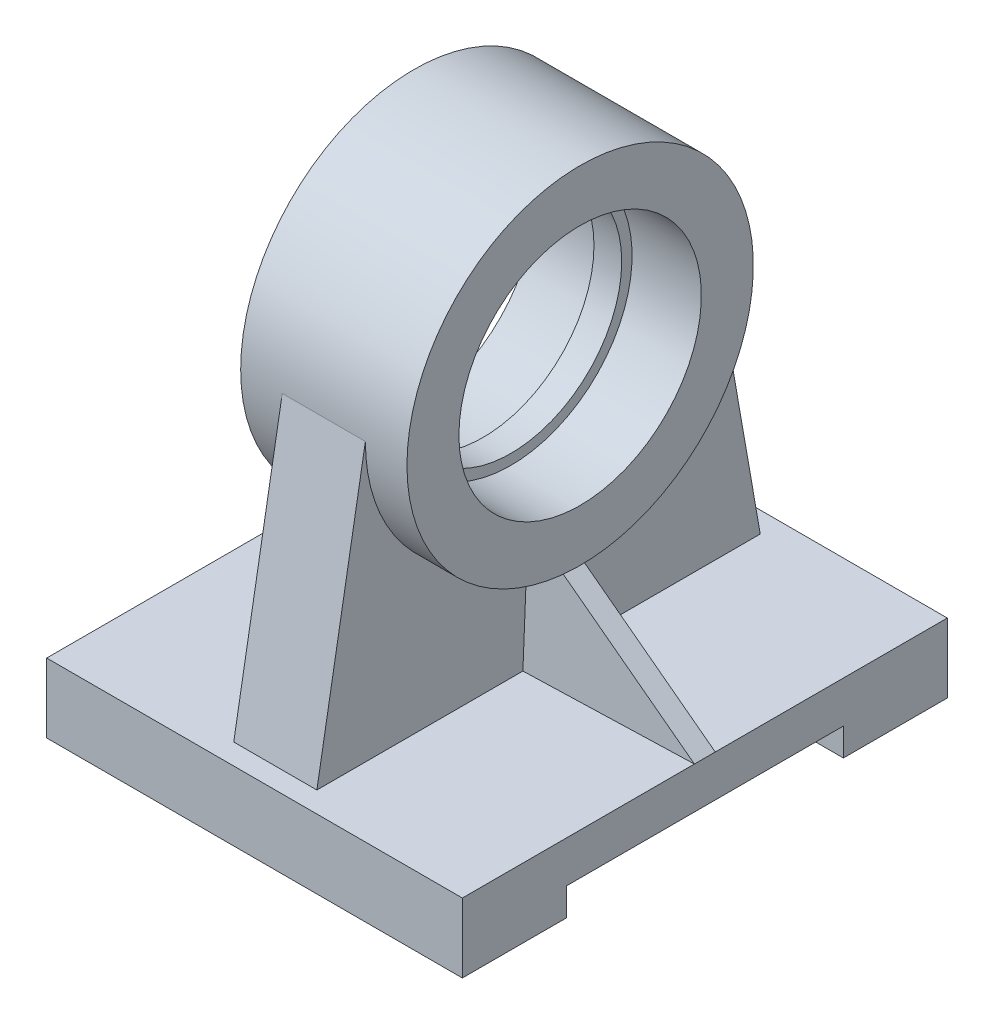
ISO-10303-21;
HEADER;
FILE_DESCRIPTION(('STEP AP214'),'2;1');
FILE_NAME('part.step','',(''),(''),'','','');
FILE_SCHEMA(('AUTOMOTIVE_DESIGN { 1 0 10303 214 1 1 1 1 }'));
ENDSEC;
DATA;
#1=APPLICATION_CONTEXT('core data for automotive mechanical design processes');
#2=APPLICATION_PROTOCOL_DEFINITION('international standard','automotive_design',2000,#1);
#3=PRODUCT_CONTEXT('',#1,'mechanical');
#4=PRODUCT('Part','Part','',(#3));
#5=PRODUCT_RELATED_PRODUCT_CATEGORY('part','',(#4));
#6=PRODUCT_DEFINITION_FORMATION('','',#4);
#7=PRODUCT_DEFINITION_CONTEXT('part definition',#1,'design');
#8=PRODUCT_DEFINITION('design','',#6,#7);
#9=PRODUCT_DEFINITION_SHAPE('','',#8);
#10=(LENGTH_UNIT() NAMED_UNIT(*) SI_UNIT(.MILLI.,.METRE.));
#11=(NAMED_UNIT(*) PLANE_ANGLE_UNIT() SI_UNIT($,.RADIAN.));
#12=(NAMED_UNIT(*) SI_UNIT($,.STERADIAN.) SOLID_ANGLE_UNIT());
#13=UNCERTAINTY_MEASURE_WITH_UNIT(LENGTH_MEASURE(1.E-05),#10,'distance_accuracy_value','');
#14=(GEOMETRIC_REPRESENTATION_CONTEXT(3) GLOBAL_UNCERTAINTY_ASSIGNED_CONTEXT((#13)) GLOBAL_UNIT_ASSIGNED_CONTEXT((#10,
#11,#12)) REPRESENTATION_CONTEXT('',''));
#15=CARTESIAN_POINT('',(0.,0.,0.));
#16=DIRECTION('',(0.,0.,1.));
#17=DIRECTION('',(1.,0.,0.));
#18=AXIS2_PLACEMENT_3D('',#15,#16,#17);
#19=CARTESIAN_POINT('',(-30.,-50.0694080199998,-35.0000000000006));
#20=DIRECTION('',(0.,-1.,0.));
#21=DIRECTION('',(0.,0.,-1.));
#22=AXIS2_PLACEMENT_3D('',#19,#20,#21);
#23=PLANE('',#22);
#24=DIRECTION('',(1.,0.,0.));
#25=VECTOR('',#24,1.);
#26=CARTESIAN_POINT('',(-30.,-50.0694080199999,-20.0000000000006));
#27=LINE('',#26,#25);
#28=CARTESIAN_POINT('',(-30.,-50.0694080199999,-20.0000000000006));
#29=VERTEX_POINT('',#28);
#30=CARTESIAN_POINT('',(30.,-50.0694080199999,-20.0000000000006));
#31=VERTEX_POINT('',#30);
#32=EDGE_CURVE('E204',#29,#31,#27,.T.);
#33=ORIENTED_EDGE('',*,*,#32,.F.);
#34=DIRECTION('',(0.,0.,-1.));
#35=VECTOR('',#34,1.);
#36=CARTESIAN_POINT('',(-30.,-50.0694080199998,-35.0000000000006));
#37=LINE('',#36,#35);
#38=CARTESIAN_POINT('',(-30.,-50.0694080199998,-35.0000000000006));
#39=VERTEX_POINT('',#38);
#40=EDGE_CURVE('E275',#29,#39,#37,.T.);
#41=ORIENTED_EDGE('',*,*,#40,.T.);
#42=DIRECTION('',(1.,0.,0.));
#43=VECTOR('',#42,1.);
#44=CARTESIAN_POINT('',(-30.,-50.0694080199998,-35.0000000000006));
#45=LINE('',#44,#43);
#46=CARTESIAN_POINT('',(30.,-50.0694080199998,-35.0000000000006));
#47=VERTEX_POINT('',#46);
#48=EDGE_CURVE('E280',#39,#47,#45,.T.);
#49=ORIENTED_EDGE('',*,*,#48,.T.);
#50=DIRECTION('',(0.,0.,-1.));
#51=VECTOR('',#50,1.);
#52=CARTESIAN_POINT('',(30.,-50.0694080199998,-35.0000000000006));
#53=LINE('',#52,#51);
#54=EDGE_CURVE('E262',#31,#47,#53,.T.);
#55=ORIENTED_EDGE('',*,*,#54,.F.);
#56=EDGE_LOOP('',(#33,#41,#49,#55));
#57=FACE_BOUND('',#56,.T.);
#58=ADVANCED_FACE('F35',(#57),#23,.T.);
#59=CARTESIAN_POINT('',(-6.,0.,0.));
#60=DIRECTION('',(1.,0.,0.));
#61=DIRECTION('',(0.,0.,-1.));
#62=AXIS2_PLACEMENT_3D('',#59,#60,#61);
#63=PLANE('',#62);
#64=DIRECTION('',(0.,-1.,0.));
#65=VECTOR('',#64,1.);
#66=CARTESIAN_POINT('',(-6.,0.,-2.));
#67=LINE('',#66,#65);
#68=CARTESIAN_POINT('',(-6.,-24.9198715887544,-2.));
#69=VERTEX_POINT('',#68);
#70=CARTESIAN_POINT('',(-6.,-40.0694080199996,-2.));
#71=VERTEX_POINT('',#70);
#72=EDGE_CURVE('E216',#69,#71,#67,.T.);
#73=ORIENTED_EDGE('',*,*,#72,.F.);
#74=CARTESIAN_POINT('',(-6.,0.,0.));
#75=DIRECTION('',(-1.,0.,0.));
#76=DIRECTION('',(0.,0.,-1.));
#77=AXIS2_PLACEMENT_3D('',#74,#75,#76);
#78=CIRCLE('',#77,25.0000000000002);
#79=CARTESIAN_POINT('',(-6.,1.73472347597681E-13,-25.0000000000003));
#80=VERTEX_POINT('',#79);
#81=EDGE_CURVE('E302',#80,#69,#78,.T.);
#82=ORIENTED_EDGE('',*,*,#81,.F.);
#83=DIRECTION('',(0.,0.985081128769097,0.172090585863962));
#84=VECTOR('',#83,1.);
#85=CARTESIAN_POINT('',(-6.,1.73472347597681E-13,-25.0000000000003));
#86=LINE('',#85,#84);
#87=CARTESIAN_POINT('',(-6.,-40.0694080199998,-32.0000000000005));
#88=VERTEX_POINT('',#87);
#89=EDGE_CURVE('E312',#88,#80,#86,.T.);
#90=ORIENTED_EDGE('',*,*,#89,.F.);
#91=DIRECTION('',(0.,0.,-1.));
#92=VECTOR('',#91,1.);
#93=CARTESIAN_POINT('',(-6.,-40.0694080199998,32.));
#94=LINE('',#93,#92);
#95=EDGE_CURVE('E308',#71,#88,#94,.T.);
#96=ORIENTED_EDGE('',*,*,#95,.F.);
#97=EDGE_LOOP('',(#73,#82,#90,#96));
#98=FACE_BOUND('',#97,.T.);
#99=ADVANCED_FACE('F363',(#98),#63,.F.);
#100=CARTESIAN_POINT('',(-30.,-40.06940802,35.));
#101=DIRECTION('',(0.,1.,0.));
#102=DIRECTION('',(0.,0.,1.));
#103=AXIS2_PLACEMENT_3D('',#100,#101,#102);
#104=PLANE('',#103);
#105=DIRECTION('',(1.,0.,0.));
#106=VECTOR('',#105,1.);
#107=CARTESIAN_POINT('',(-30.,-40.0694080199999,2.));
#108=LINE('',#107,#106);
#109=CARTESIAN_POINT('',(-30.,-40.06940802,2.));
#110=VERTEX_POINT('',#109);
#111=CARTESIAN_POINT('',(-6.,-40.0694080199996,2.));
#112=VERTEX_POINT('',#111);
#113=EDGE_CURVE('E220',#110,#112,#108,.T.);
#114=ORIENTED_EDGE('',*,*,#113,.F.);
#115=DIRECTION('',(0.,0.,1.));
#116=VECTOR('',#115,1.);
#117=CARTESIAN_POINT('',(-30.,-40.06940802,35.));
#118=LINE('',#117,#116);
#119=CARTESIAN_POINT('',(-30.,-40.06940802,35.));
#120=VERTEX_POINT('',#119);
#121=EDGE_CURVE('E267',#110,#120,#118,.T.);
#122=ORIENTED_EDGE('',*,*,#121,.T.);
#123=DIRECTION('',(1.,0.,0.));
#124=VECTOR('',#123,1.);
#125=CARTESIAN_POINT('',(-30.,-40.06940802,35.));
#126=LINE('',#125,#124);
#127=CARTESIAN_POINT('',(30.,-40.06940802,35.));
#128=VERTEX_POINT('',#127);
#129=EDGE_CURVE('E286',#120,#128,#126,.T.);
#130=ORIENTED_EDGE('',*,*,#129,.T.);
#131=DIRECTION('',(0.,0.,1.));
#132=VECTOR('',#131,1.);
#133=CARTESIAN_POINT('',(30.,-40.06940802,35.));
#134=LINE('',#133,#132);
#135=CARTESIAN_POINT('',(30.,-40.0694080199999,1.5055801745095));
#136=VERTEX_POINT('',#135);
#137=EDGE_CURVE('E256',#136,#128,#134,.T.);
#138=ORIENTED_EDGE('',*,*,#137,.F.);
#139=DIRECTION('',(0.999503061957107,0.,-0.0315218834838297));
#140=VECTOR('',#139,1.);
#141=CARTESIAN_POINT('',(-30.9956647800323,-40.0694080199999,3.42923434966542));
#142=LINE('',#141,#140);
#143=CARTESIAN_POINT('',(5.99999999999999,-40.0694080199998,2.26248151119033));
#144=VERTEX_POINT('',#143);
#145=EDGE_CURVE('E243',#144,#136,#142,.T.);
#146=ORIENTED_EDGE('',*,*,#145,.F.);
#147=DIRECTION('',(0.,0.,-1.));
#148=VECTOR('',#147,1.);
#149=CARTESIAN_POINT('',(6.,-40.0694080199998,32.));
#150=LINE('',#149,#148);
#151=CARTESIAN_POINT('',(6.,-40.06940802,32.));
#152=VERTEX_POINT('',#151);
#153=EDGE_CURVE('E296',#152,#144,#150,.T.);
#154=ORIENTED_EDGE('',*,*,#153,.F.);
#155=DIRECTION('',(1.,0.,0.));
#156=VECTOR('',#155,1.);
#157=CARTESIAN_POINT('',(-6.,-40.0694080199998,32.));
#158=LINE('',#157,#156);
#159=CARTESIAN_POINT('',(-6.,-40.06940802,32.));
#160=VERTEX_POINT('',#159);
#161=EDGE_CURVE('E323',#160,#152,#158,.T.);
#162=ORIENTED_EDGE('',*,*,#161,.F.);
#163=EDGE_CURVE('E309',#160,#112,#94,.T.);
#164=ORIENTED_EDGE('',*,*,#163,.T.);
#165=EDGE_LOOP('',(#114,#122,#130,#138,#146,#154,#162,#164));
#166=FACE_BOUND('',#165,.T.);
#167=ADVANCED_FACE('F370',(#166),#104,.T.);
#168=CARTESIAN_POINT('',(6.,0.,0.));
#169=DIRECTION('',(1.,0.,0.));
#170=DIRECTION('',(0.,0.,-1.));
#171=AXIS2_PLACEMENT_3D('',#168,#169,#170);
#172=PLANE('',#171);
#173=DIRECTION('',(0.,-0.999125170375753,-0.0418197790719003));
#174=VECTOR('',#173,1.);
#175=CARTESIAN_POINT('',(6.,0.0244565595260672,-0.584296826658878));
#176=LINE('',#175,#174);
#177=CARTESIAN_POINT('',(6.,-24.9468377304652,-1.62950521626846));
#178=VERTEX_POINT('',#177);
#179=CARTESIAN_POINT('',(6.,-40.0694080199998,-2.26248151119033));
#180=VERTEX_POINT('',#179);
#181=EDGE_CURVE('E239',#178,#180,#176,.T.);
#182=ORIENTED_EDGE('',*,*,#181,.T.);
#183=CARTESIAN_POINT('',(6.,-40.0694080199995,-32.0000000000005));
#184=VERTEX_POINT('',#183);
#185=EDGE_CURVE('E295',#180,#184,#150,.T.);
#186=ORIENTED_EDGE('',*,*,#185,.T.);
#187=DIRECTION('',(0.,0.985081128769097,0.172090585863962));
#188=VECTOR('',#187,1.);
#189=CARTESIAN_POINT('',(6.,1.73472347597681E-13,-25.0000000000003));
#190=LINE('',#189,#188);
#191=CARTESIAN_POINT('',(6.00000000000001,0.,-25.));
#192=VERTEX_POINT('',#191);
#193=EDGE_CURVE('E299',#184,#192,#190,.T.);
#194=ORIENTED_EDGE('',*,*,#193,.T.);
#195=CARTESIAN_POINT('',(6.,0.,0.));
#196=DIRECTION('',(-1.,0.,0.));
#197=DIRECTION('',(0.,0.,-1.));
#198=AXIS2_PLACEMENT_3D('',#195,#196,#197);
#199=CIRCLE('',#198,25.0000000000002);
#200=EDGE_CURVE('E290',#192,#178,#199,.T.);
#201=ORIENTED_EDGE('',*,*,#200,.T.);
#202=EDGE_LOOP('',(#182,#186,#194,#201));
#203=FACE_BOUND('',#202,.T.);
#204=ADVANCED_FACE('F454',(#203),#172,.T.);
#205=CARTESIAN_POINT('',(-66.4679952920497,0.,0.));
#206=DIRECTION('',(-1.,0.,0.));
#207=DIRECTION('',(0.,0.,1.));
#208=AXIS2_PLACEMENT_3D('',#205,#206,#207);
#209=CYLINDRICAL_SURFACE('',#208,25.);
#210=CARTESIAN_POINT('',(12.0000000000004,0.,0.));
#211=DIRECTION('',(-1.,0.,0.));
#212=DIRECTION('',(0.,0.,1.));
#213=AXIS2_PLACEMENT_3D('',#210,#211,#212);
#214=CIRCLE('',#213,25.0000000000001);
#215=CARTESIAN_POINT('',(12.0000000000004,0.,25.0000000000001));
#216=VERTEX_POINT('',#215);
#217=EDGE_CURVE('E43',#216,#216,#214,.T.);
#218=ORIENTED_EDGE('',*,*,#217,.T.);
#219=EDGE_LOOP('',(#218));
#220=FACE_BOUND('',#219,.T.);
#221=DIRECTION('',(1.,0.,0.));
#222=VECTOR('',#221,1.);
#223=CARTESIAN_POINT('',(-6.,0.,25.0000000000001));
#224=LINE('',#223,#222);
#225=CARTESIAN_POINT('',(-6.,0.,25.0000000000001));
#226=VERTEX_POINT('',#225);
#227=CARTESIAN_POINT('',(6.,0.,25.0000000000001));
#228=VERTEX_POINT('',#227);
#229=EDGE_CURVE('E315',#226,#228,#224,.T.);
#230=ORIENTED_EDGE('',*,*,#229,.T.);
#231=CARTESIAN_POINT('',(6.,-24.9468377304652,1.62950521626846));
#232=VERTEX_POINT('',#231);
#233=EDGE_CURVE('E283',#232,#228,#199,.T.);
#234=ORIENTED_EDGE('',*,*,#233,.F.);
#235=CARTESIAN_POINT('',(24.5594754319652,0.,0.));
#236=DIRECTION('',(0.0314943345710287,0.0417990335509261,0.998629534754574));
#237=DIRECTION('',(-0.999503930402441,0.00131708611377693,0.03146678239415));
#238=AXIS2_PLACEMENT_3D('',#235,#236,#237);
#239=ELLIPSE('',#238,793.793561302842,25.);
#240=CARTESIAN_POINT('',(9.9397765142211,-24.9546233860206,1.50558017450951));
#241=VERTEX_POINT('',#240);
#242=EDGE_CURVE('E247',#232,#241,#239,.T.);
#243=ORIENTED_EDGE('',*,*,#242,.T.);
#244=CARTESIAN_POINT('',(-23.1798037014066,0.,0.));
#245=DIRECTION('',(0.601772411013792,0.79866761881439,0.));
#246=DIRECTION('',(-0.79866761881439,0.601772411013792,0.));
#247=AXIS2_PLACEMENT_3D('',#244,#245,#246);
#248=ELLIPSE('',#247,41.5439450902761,25.);
#249=CARTESIAN_POINT('',(9.93977651422111,-24.9546233860206,-1.50558017450951));
#250=VERTEX_POINT('',#249);
#251=EDGE_CURVE('E250',#241,#250,#248,.T.);
#252=ORIENTED_EDGE('',*,*,#251,.T.);
#253=CARTESIAN_POINT('',(24.5594754319652,0.,0.));
#254=DIRECTION('',(-0.0314943345710287,-0.0417990335509261,0.998629534754574));
#255=DIRECTION('',(-0.999503930402441,0.00131708611377693,-0.03146678239415));
#256=AXIS2_PLACEMENT_3D('',#253,#254,#255);
#257=ELLIPSE('',#256,793.793561302842,25.);
#258=EDGE_CURVE('E241',#178,#250,#257,.T.);
#259=ORIENTED_EDGE('',*,*,#258,.F.);
#260=ORIENTED_EDGE('',*,*,#200,.F.);
#261=DIRECTION('',(1.,0.,0.));
#262=VECTOR('',#261,1.);
#263=CARTESIAN_POINT('',(-6.,1.73472347597681E-13,-25.0000000000003));
#264=LINE('',#263,#262);
#265=EDGE_CURVE('E316',#80,#192,#264,.T.);
#266=ORIENTED_EDGE('',*,*,#265,.F.);
#267=ORIENTED_EDGE('',*,*,#81,.T.);
#268=DIRECTION('',(-1.,0.,0.));
#269=VECTOR('',#268,1.);
#270=CARTESIAN_POINT('',(-66.4679952920497,-24.9198715887543,-2.));
#271=LINE('',#270,#269);
#272=CARTESIAN_POINT('',(-9.89365420175839,-24.9198715887543,-2.));
#273=VERTEX_POINT('',#272);
#274=EDGE_CURVE('E217',#273,#69,#271,.F.);
#275=ORIENTED_EDGE('',*,*,#274,.F.);
#276=CARTESIAN_POINT('',(23.1798037014066,0.,0.));
#277=DIRECTION('',(0.601772411013792,-0.79866761881439,0.));
#278=DIRECTION('',(-0.79866761881439,-0.601772411013792,0.));
#279=AXIS2_PLACEMENT_3D('',#276,#277,#278);
#280=ELLIPSE('',#279,41.5439450902761,25.);
#281=CARTESIAN_POINT('',(-9.89365420175839,-24.9198715887543,2.));
#282=VERTEX_POINT('',#281);
#283=EDGE_CURVE('E58',#273,#282,#280,.F.);
#284=ORIENTED_EDGE('',*,*,#283,.T.);
#285=DIRECTION('',(-1.,0.,0.));
#286=VECTOR('',#285,1.);
#287=CARTESIAN_POINT('',(-66.4679952920497,-24.9198715887543,2.));
#288=LINE('',#287,#286);
#289=CARTESIAN_POINT('',(-6.,-24.9198715887544,2.));
#290=VERTEX_POINT('',#289);
#291=EDGE_CURVE('E226',#282,#290,#288,.F.);
#292=ORIENTED_EDGE('',*,*,#291,.T.);
#293=EDGE_CURVE('E301',#290,#226,#78,.T.);
#294=ORIENTED_EDGE('',*,*,#293,.T.);
#295=EDGE_LOOP('',(#230,#234,#243,#252,#259,#260,#266,#267,#275,#284,#292,#294));
#296=FACE_BOUND('',#295,.T.);
#297=CARTESIAN_POINT('',(-12.,0.,0.));
#298=DIRECTION('',(-1.,0.,0.));
#299=DIRECTION('',(0.,0.,1.));
#300=AXIS2_PLACEMENT_3D('',#297,#298,#299);
#301=CIRCLE('',#300,25.);
#302=CARTESIAN_POINT('',(-12.,0.,25.));
#303=VERTEX_POINT('',#302);
#304=EDGE_CURVE('E342',#303,#303,#301,.T.);
#305=ORIENTED_EDGE('',*,*,#304,.F.);
#306=EDGE_LOOP('',(#305));
#307=FACE_BOUND('',#306,.T.);
#308=ADVANCED_FACE('F347',(#220,#296,#307),#209,.T.);
#309=CARTESIAN_POINT('',(-66.4679952920497,0.,0.));
#310=DIRECTION('',(-1.,0.,0.));
#311=DIRECTION('',(0.,0.,1.));
#312=AXIS2_PLACEMENT_3D('',#309,#310,#311);
#313=CYLINDRICAL_SURFACE('',#312,17.5000000000001);
#314=CARTESIAN_POINT('',(2.00000000000045,0.,0.));
#315=DIRECTION('',(-1.,0.,0.));
#316=DIRECTION('',(0.,0.,1.));
#317=AXIS2_PLACEMENT_3D('',#314,#315,#316);
#318=CIRCLE('',#317,17.5);
#319=CARTESIAN_POINT('',(2.00000000000045,0.,17.5));
#320=VERTEX_POINT('',#319);
#321=EDGE_CURVE('E319',#320,#320,#318,.T.);
#322=ORIENTED_EDGE('',*,*,#321,.T.);
#323=EDGE_LOOP('',(#322));
#324=FACE_BOUND('',#323,.T.);
#325=CARTESIAN_POINT('',(12.0000000000005,0.,0.));
#326=DIRECTION('',(-1.,0.,0.));
#327=DIRECTION('',(0.,0.,1.));
#328=AXIS2_PLACEMENT_3D('',#325,#326,#327);
#329=CIRCLE('',#328,17.5000000000001);
#330=CARTESIAN_POINT('',(12.0000000000005,0.,17.5000000000001));
#331=VERTEX_POINT('',#330);
#332=EDGE_CURVE('E11',#331,#331,#329,.T.);
#333=ORIENTED_EDGE('',*,*,#332,.F.);
#334=EDGE_LOOP('',(#333));
#335=FACE_BOUND('',#334,.T.);
#336=ADVANCED_FACE('F37',(#324,#335),#313,.F.);
#337=CARTESIAN_POINT('',(12.0000000000004,17.5000000000001,0.));
#338=DIRECTION('',(-1.,0.,0.));
#339=DIRECTION('',(0.,0.,1.));
#340=AXIS2_PLACEMENT_3D('',#337,#338,#339);
#341=PLANE('',#340);
#342=ORIENTED_EDGE('',*,*,#332,.T.);
#343=EDGE_LOOP('',(#342));
#344=FACE_BOUND('',#343,.T.);
#345=ORIENTED_EDGE('',*,*,#217,.F.);
#346=EDGE_LOOP('',(#345));
#347=FACE_BOUND('',#346,.T.);
#348=ADVANCED_FACE('F349',(#344,#347),#341,.F.);
#349=CARTESIAN_POINT('',(-12.,17.5,0.));
#350=DIRECTION('',(1.,0.,0.));
#351=DIRECTION('',(0.,0.,-1.));
#352=AXIS2_PLACEMENT_3D('',#349,#350,#351);
#353=PLANE('',#352);
#354=ORIENTED_EDGE('',*,*,#304,.T.);
#355=EDGE_LOOP('',(#354));
#356=FACE_BOUND('',#355,.T.);
#357=CARTESIAN_POINT('',(-12.,0.,0.));
#358=DIRECTION('',(-1.,0.,0.));
#359=DIRECTION('',(0.,0.,1.));
#360=AXIS2_PLACEMENT_3D('',#357,#358,#359);
#361=CIRCLE('',#360,17.5);
#362=CARTESIAN_POINT('',(-12.,0.,17.5));
#363=VERTEX_POINT('',#362);
#364=EDGE_CURVE('E339',#363,#363,#361,.T.);
#365=ORIENTED_EDGE('',*,*,#364,.F.);
#366=EDGE_LOOP('',(#365));
#367=FACE_BOUND('',#366,.T.);
#368=ADVANCED_FACE('F351',(#356,#367),#353,.F.);
#369=CARTESIAN_POINT('',(-66.4679952920497,0.,0.));
#370=DIRECTION('',(-1.,0.,0.));
#371=DIRECTION('',(0.,0.,1.));
#372=AXIS2_PLACEMENT_3D('',#369,#370,#371);
#373=CYLINDRICAL_SURFACE('',#372,17.5);
#374=ORIENTED_EDGE('',*,*,#364,.T.);
#375=EDGE_LOOP('',(#374));
#376=FACE_BOUND('',#375,.T.);
#377=CARTESIAN_POINT('',(-2.,0.,0.));
#378=DIRECTION('',(-1.,0.,0.));
#379=DIRECTION('',(0.,0.,1.));
#380=AXIS2_PLACEMENT_3D('',#377,#378,#379);
#381=CIRCLE('',#380,17.5);
#382=CARTESIAN_POINT('',(-2.,0.,17.5));
#383=VERTEX_POINT('',#382);
#384=EDGE_CURVE('E336',#383,#383,#381,.T.);
#385=ORIENTED_EDGE('',*,*,#384,.F.);
#386=EDGE_LOOP('',(#385));
#387=FACE_BOUND('',#386,.T.);
#388=ADVANCED_FACE('F357',(#376,#387),#373,.F.);
#389=CARTESIAN_POINT('',(-1.99999999999999,16.,0.));
#390=DIRECTION('',(1.,0.,0.));
#391=DIRECTION('',(0.,0.,-1.));
#392=AXIS2_PLACEMENT_3D('',#389,#390,#391);
#393=PLANE('',#392);
#394=CARTESIAN_POINT('',(-2.,0.,0.));
#395=DIRECTION('',(-1.,0.,0.));
#396=DIRECTION('',(0.,0.,1.));
#397=AXIS2_PLACEMENT_3D('',#394,#395,#396);
#398=CIRCLE('',#397,16.);
#399=CARTESIAN_POINT('',(-2.,0.,16.));
#400=VERTEX_POINT('',#399);
#401=EDGE_CURVE('E333',#400,#400,#398,.T.);
#402=ORIENTED_EDGE('',*,*,#401,.F.);
#403=EDGE_LOOP('',(#402));
#404=FACE_BOUND('',#403,.T.);
#405=ORIENTED_EDGE('',*,*,#384,.T.);
#406=EDGE_LOOP('',(#405));
#407=FACE_BOUND('',#406,.T.);
#408=ADVANCED_FACE('F481',(#404,#407),#393,.F.);
#409=CARTESIAN_POINT('',(-66.4679952920497,0.,0.));
#410=DIRECTION('',(-1.,0.,0.));
#411=DIRECTION('',(0.,0.,1.));
#412=AXIS2_PLACEMENT_3D('',#409,#410,#411);
#413=CYLINDRICAL_SURFACE('',#412,16.);
#414=CARTESIAN_POINT('',(2.00000000000046,0.,0.));
#415=DIRECTION('',(-1.,0.,0.));
#416=DIRECTION('',(0.,0.,1.));
#417=AXIS2_PLACEMENT_3D('',#414,#415,#416);
#418=CIRCLE('',#417,16.);
#419=CARTESIAN_POINT('',(2.00000000000046,0.,16.));
#420=VERTEX_POINT('',#419);
#421=EDGE_CURVE('E330',#420,#420,#418,.T.);
#422=ORIENTED_EDGE('',*,*,#421,.F.);
#423=EDGE_LOOP('',(#422));
#424=FACE_BOUND('',#423,.T.);
#425=ORIENTED_EDGE('',*,*,#401,.T.);
#426=EDGE_LOOP('',(#425));
#427=FACE_BOUND('',#426,.T.);
#428=ADVANCED_FACE('F477',(#424,#427),#413,.F.);
#429=CARTESIAN_POINT('',(2.00000000000046,16.,0.));
#430=DIRECTION('',(-1.,0.,0.));
#431=DIRECTION('',(0.,0.,1.));
#432=AXIS2_PLACEMENT_3D('',#429,#430,#431);
#433=PLANE('',#432);
#434=ORIENTED_EDGE('',*,*,#421,.T.);
#435=EDGE_LOOP('',(#434));
#436=FACE_BOUND('',#435,.T.);
#437=ORIENTED_EDGE('',*,*,#321,.F.);
#438=EDGE_LOOP('',(#437));
#439=FACE_BOUND('',#438,.T.);
#440=ADVANCED_FACE('F473',(#436,#439),#433,.F.);
#441=CARTESIAN_POINT('',(-6.,1.73472347597681E-13,-25.0000000000003));
#442=DIRECTION('',(0.,0.172090585863962,-0.985081128769097));
#443=DIRECTION('',(0.,0.985081128769097,0.172090585863962));
#444=AXIS2_PLACEMENT_3D('',#441,#442,#443);
#445=PLANE('',#444);
#446=ORIENTED_EDGE('',*,*,#265,.T.);
#447=ORIENTED_EDGE('',*,*,#193,.F.);
#448=DIRECTION('',(1.,0.,0.));
#449=VECTOR('',#448,1.);
#450=CARTESIAN_POINT('',(-6.,-40.0694080199995,-32.0000000000005));
#451=LINE('',#450,#449);
#452=EDGE_CURVE('E320',#88,#184,#451,.T.);
#453=ORIENTED_EDGE('',*,*,#452,.F.);
#454=ORIENTED_EDGE('',*,*,#89,.T.);
#455=EDGE_LOOP('',(#446,#447,#453,#454));
#456=FACE_BOUND('',#455,.T.);
#457=ADVANCED_FACE('F451',(#456),#445,.T.);
#458=CARTESIAN_POINT('',(-6.,0.,25.0000000000001));
#459=DIRECTION('',(0.,0.172090585863955,0.985081128769098));
#460=DIRECTION('',(0.,-0.985081128769098,0.172090585863955));
#461=AXIS2_PLACEMENT_3D('',#458,#459,#460);
#462=PLANE('',#461);
#463=ORIENTED_EDGE('',*,*,#161,.T.);
#464=DIRECTION('',(0.,-0.985081128769098,0.172090585863955));
#465=VECTOR('',#464,1.);
#466=CARTESIAN_POINT('',(6.,0.,25.0000000000001));
#467=LINE('',#466,#465);
#468=EDGE_CURVE('E292',#228,#152,#467,.T.);
#469=ORIENTED_EDGE('',*,*,#468,.F.);
#470=ORIENTED_EDGE('',*,*,#229,.F.);
#471=DIRECTION('',(0.,-0.985081128769098,0.172090585863955));
#472=VECTOR('',#471,1.);
#473=CARTESIAN_POINT('',(-6.,0.,25.0000000000001));
#474=LINE('',#473,#472);
#475=EDGE_CURVE('E305',#226,#160,#474,.T.);
#476=ORIENTED_EDGE('',*,*,#475,.T.);
#477=EDGE_LOOP('',(#463,#469,#470,#476));
#478=FACE_BOUND('',#477,.T.);
#479=ADVANCED_FACE('F430',(#478),#462,.T.);
#480=ORIENTED_EDGE('',*,*,#293,.F.);
#481=DIRECTION('',(0.,-1.,0.));
#482=VECTOR('',#481,1.);
#483=CARTESIAN_POINT('',(-6.,0.,2.));
#484=LINE('',#483,#482);
#485=EDGE_CURVE('E225',#290,#112,#484,.T.);
#486=ORIENTED_EDGE('',*,*,#485,.T.);
#487=ORIENTED_EDGE('',*,*,#163,.F.);
#488=ORIENTED_EDGE('',*,*,#475,.F.);
#489=EDGE_LOOP('',(#480,#486,#487,#488));
#490=FACE_BOUND('',#489,.T.);
#491=ADVANCED_FACE('F373',(#490),#63,.F.);
#492=ORIENTED_EDGE('',*,*,#153,.T.);
#493=DIRECTION('',(0.,-0.999125170375753,0.0418197790719003));
#494=VECTOR('',#493,1.);
#495=CARTESIAN_POINT('',(6.,0.0244565595260672,0.584296826658878));
#496=LINE('',#495,#494);
#497=EDGE_CURVE('E245',#232,#144,#496,.T.);
#498=ORIENTED_EDGE('',*,*,#497,.F.);
#499=ORIENTED_EDGE('',*,*,#233,.T.);
#500=ORIENTED_EDGE('',*,*,#468,.T.);
#501=EDGE_LOOP('',(#492,#498,#499,#500));
#502=FACE_BOUND('',#501,.T.);
#503=ADVANCED_FACE('F426',(#502),#172,.T.);
#504=DIRECTION('',(0.999503061957107,0.,0.0315218834838297));
#505=VECTOR('',#504,1.);
#506=CARTESIAN_POINT('',(-28.7902294457803,-40.0694080199999,-3.35968030997965));
#507=LINE('',#506,#505);
#508=CARTESIAN_POINT('',(30.,-40.06940802,-1.50558017450951));
#509=VERTEX_POINT('',#508);
#510=EDGE_CURVE('E234',#180,#509,#507,.T.);
#511=ORIENTED_EDGE('',*,*,#510,.T.);
#512=CARTESIAN_POINT('',(30.,-40.0694080199998,-35.0000000000005));
#513=VERTEX_POINT('',#512);
#514=EDGE_CURVE('E257',#513,#509,#134,.T.);
#515=ORIENTED_EDGE('',*,*,#514,.F.);
#516=DIRECTION('',(1.,0.,0.));
#517=VECTOR('',#516,1.);
#518=CARTESIAN_POINT('',(-30.,-40.0694080199998,-35.0000000000005));
#519=LINE('',#518,#517);
#520=CARTESIAN_POINT('',(-30.,-40.0694080199998,-35.0000000000005));
#521=VERTEX_POINT('',#520);
#522=EDGE_CURVE('E279',#521,#513,#519,.T.);
#523=ORIENTED_EDGE('',*,*,#522,.F.);
#524=CARTESIAN_POINT('',(-30.,-40.0694080199999,-2.));
#525=VERTEX_POINT('',#524);
#526=EDGE_CURVE('E268',#521,#525,#118,.T.);
#527=ORIENTED_EDGE('',*,*,#526,.T.);
#528=DIRECTION('',(1.,0.,0.));
#529=VECTOR('',#528,1.);
#530=CARTESIAN_POINT('',(-30.,-40.0694080199999,-2.));
#531=LINE('',#530,#529);
#532=EDGE_CURVE('E212',#525,#71,#531,.T.);
#533=ORIENTED_EDGE('',*,*,#532,.T.);
#534=ORIENTED_EDGE('',*,*,#95,.T.);
#535=ORIENTED_EDGE('',*,*,#452,.T.);
#536=ORIENTED_EDGE('',*,*,#185,.F.);
#537=EDGE_LOOP('',(#511,#515,#523,#527,#533,#534,#535,#536));
#538=FACE_BOUND('',#537,.T.);
#539=ADVANCED_FACE('F387',(#538),#104,.T.);
#540=CARTESIAN_POINT('',(-30.,-50.0694080199998,-35.0000000000006));
#541=DIRECTION('',(0.,0.,-1.));
#542=DIRECTION('',(0.,1.,0.));
#543=AXIS2_PLACEMENT_3D('',#540,#541,#542);
#544=PLANE('',#543);
#545=ORIENTED_EDGE('',*,*,#522,.T.);
#546=DIRECTION('',(0.,1.,0.));
#547=VECTOR('',#546,1.);
#548=CARTESIAN_POINT('',(30.,-50.0694080199998,-35.0000000000006));
#549=LINE('',#548,#547);
#550=EDGE_CURVE('E253',#47,#513,#549,.T.);
#551=ORIENTED_EDGE('',*,*,#550,.F.);
#552=ORIENTED_EDGE('',*,*,#48,.F.);
#553=DIRECTION('',(0.,1.,0.));
#554=VECTOR('',#553,1.);
#555=CARTESIAN_POINT('',(-30.,-50.0694080199998,-35.0000000000006));
#556=LINE('',#555,#554);
#557=EDGE_CURVE('E264',#39,#521,#556,.T.);
#558=ORIENTED_EDGE('',*,*,#557,.T.);
#559=EDGE_LOOP('',(#545,#551,#552,#558));
#560=FACE_BOUND('',#559,.T.);
#561=ADVANCED_FACE('F379',(#560),#544,.T.);
#562=DIRECTION('',(1.,0.,0.));
#563=VECTOR('',#562,1.);
#564=CARTESIAN_POINT('',(-30.,-50.06940802,20.));
#565=LINE('',#564,#563);
#566=CARTESIAN_POINT('',(-30.,-50.06940802,20.));
#567=VERTEX_POINT('',#566);
#568=CARTESIAN_POINT('',(30.,-50.06940802,20.));
#569=VERTEX_POINT('',#568);
#570=EDGE_CURVE('E182',#567,#569,#565,.T.);
#571=ORIENTED_EDGE('',*,*,#570,.T.);
#572=CARTESIAN_POINT('',(30.,-50.06940802,35.));
#573=VERTEX_POINT('',#572);
#574=EDGE_CURVE('E194',#573,#569,#53,.T.);
#575=ORIENTED_EDGE('',*,*,#574,.F.);
#576=DIRECTION('',(1.,0.,0.));
#577=VECTOR('',#576,1.);
#578=CARTESIAN_POINT('',(-30.,-50.06940802,35.));
#579=LINE('',#578,#577);
#580=CARTESIAN_POINT('',(-30.,-50.06940802,35.));
#581=VERTEX_POINT('',#580);
#582=EDGE_CURVE('E284',#581,#573,#579,.T.);
#583=ORIENTED_EDGE('',*,*,#582,.F.);
#584=EDGE_CURVE('E276',#581,#567,#37,.T.);
#585=ORIENTED_EDGE('',*,*,#584,.T.);
#586=EDGE_LOOP('',(#571,#575,#583,#585));
#587=FACE_BOUND('',#586,.T.);
#588=ADVANCED_FACE('F366',(#587),#23,.T.);
#589=CARTESIAN_POINT('',(-30.,-50.06940802,35.));
#590=DIRECTION('',(0.,0.,1.));
#591=DIRECTION('',(0.,-1.,0.));
#592=AXIS2_PLACEMENT_3D('',#589,#590,#591);
#593=PLANE('',#592);
#594=ORIENTED_EDGE('',*,*,#582,.T.);
#595=DIRECTION('',(0.,-1.,0.));
#596=VECTOR('',#595,1.);
#597=CARTESIAN_POINT('',(30.,-50.06940802,35.));
#598=LINE('',#597,#596);
#599=EDGE_CURVE('E259',#128,#573,#598,.T.);
#600=ORIENTED_EDGE('',*,*,#599,.F.);
#601=ORIENTED_EDGE('',*,*,#129,.F.);
#602=DIRECTION('',(0.,-1.,0.));
#603=VECTOR('',#602,1.);
#604=CARTESIAN_POINT('',(-30.,-50.06940802,35.));
#605=LINE('',#604,#603);
#606=EDGE_CURVE('E271',#120,#581,#605,.T.);
#607=ORIENTED_EDGE('',*,*,#606,.T.);
#608=EDGE_LOOP('',(#594,#600,#601,#607));
#609=FACE_BOUND('',#608,.T.);
#610=ADVANCED_FACE('F378',(#609),#593,.T.);
#611=CARTESIAN_POINT('',(-30.,0.,0.));
#612=DIRECTION('',(-1.,0.,0.));
#613=DIRECTION('',(0.,0.,1.));
#614=AXIS2_PLACEMENT_3D('',#611,#612,#613);
#615=PLANE('',#614);
#616=DIRECTION('',(0.,1.,0.));
#617=VECTOR('',#616,1.);
#618=CARTESIAN_POINT('',(-30.,-50.0694080199999,-20.0000000000006));
#619=LINE('',#618,#617);
#620=CARTESIAN_POINT('',(-30.,-46.0694080199999,-20.0000000000006));
#621=VERTEX_POINT('',#620);
#622=EDGE_CURVE('E195',#29,#621,#619,.T.);
#623=ORIENTED_EDGE('',*,*,#622,.T.);
#624=DIRECTION('',(0.,0.,1.));
#625=VECTOR('',#624,1.);
#626=CARTESIAN_POINT('',(-30.,-46.06940802,20.));
#627=LINE('',#626,#625);
#628=CARTESIAN_POINT('',(-30.,-46.06940802,20.));
#629=VERTEX_POINT('',#628);
#630=EDGE_CURVE('E198',#621,#629,#627,.T.);
#631=ORIENTED_EDGE('',*,*,#630,.T.);
#632=DIRECTION('',(0.,-1.,0.));
#633=VECTOR('',#632,1.);
#634=CARTESIAN_POINT('',(-30.,-50.06940802,20.));
#635=LINE('',#634,#633);
#636=EDGE_CURVE('E178',#629,#567,#635,.T.);
#637=ORIENTED_EDGE('',*,*,#636,.T.);
#638=ORIENTED_EDGE('',*,*,#584,.F.);
#639=ORIENTED_EDGE('',*,*,#606,.F.);
#640=ORIENTED_EDGE('',*,*,#121,.F.);
#641=EDGE_CURVE('E272',#525,#110,#118,.T.);
#642=ORIENTED_EDGE('',*,*,#641,.F.);
#643=ORIENTED_EDGE('',*,*,#526,.F.);
#644=ORIENTED_EDGE('',*,*,#557,.F.);
#645=ORIENTED_EDGE('',*,*,#40,.F.);
#646=EDGE_LOOP('',(#623,#631,#637,#638,#639,#640,#642,#643,#644,#645));
#647=FACE_BOUND('',#646,.T.);
#648=ADVANCED_FACE('F385',(#647),#615,.T.);
#649=CARTESIAN_POINT('',(30.,0.,0.));
#650=DIRECTION('',(-1.,0.,0.));
#651=DIRECTION('',(0.,0.,1.));
#652=AXIS2_PLACEMENT_3D('',#649,#650,#651);
#653=PLANE('',#652);
#654=DIRECTION('',(0.,0.,1.));
#655=VECTOR('',#654,1.);
#656=CARTESIAN_POINT('',(30.,-46.06940802,20.));
#657=LINE('',#656,#655);
#658=CARTESIAN_POINT('',(30.,-46.0694080199999,-20.0000000000006));
#659=VERTEX_POINT('',#658);
#660=CARTESIAN_POINT('',(30.,-46.06940802,20.));
#661=VERTEX_POINT('',#660);
#662=EDGE_CURVE('E186',#659,#661,#657,.T.);
#663=ORIENTED_EDGE('',*,*,#662,.F.);
#664=DIRECTION('',(0.,1.,0.));
#665=VECTOR('',#664,1.);
#666=CARTESIAN_POINT('',(30.,-50.0694080199999,-20.0000000000006));
#667=LINE('',#666,#665);
#668=EDGE_CURVE('E50',#31,#659,#667,.T.);
#669=ORIENTED_EDGE('',*,*,#668,.F.);
#670=ORIENTED_EDGE('',*,*,#54,.T.);
#671=ORIENTED_EDGE('',*,*,#550,.T.);
#672=ORIENTED_EDGE('',*,*,#514,.T.);
#673=EDGE_CURVE('E260',#509,#136,#134,.T.);
#674=ORIENTED_EDGE('',*,*,#673,.T.);
#675=ORIENTED_EDGE('',*,*,#137,.T.);
#676=ORIENTED_EDGE('',*,*,#599,.T.);
#677=ORIENTED_EDGE('',*,*,#574,.T.);
#678=DIRECTION('',(0.,-1.,0.));
#679=VECTOR('',#678,1.);
#680=CARTESIAN_POINT('',(30.,-50.06940802,20.));
#681=LINE('',#680,#679);
#682=EDGE_CURVE('E175',#661,#569,#681,.T.);
#683=ORIENTED_EDGE('',*,*,#682,.F.);
#684=EDGE_LOOP('',(#663,#669,#670,#671,#672,#674,#675,#676,#677,#683));
#685=FACE_BOUND('',#684,.T.);
#686=ADVANCED_FACE('F191',(#685),#653,.F.);
#687=CARTESIAN_POINT('',(30.,-40.06940802,0.));
#688=DIRECTION('',(0.601772411013792,0.79866761881439,0.));
#689=DIRECTION('',(-0.79866761881439,0.601772411013792,0.));
#690=AXIS2_PLACEMENT_3D('',#687,#688,#689);
#691=PLANE('',#690);
#692=ORIENTED_EDGE('',*,*,#251,.F.);
#693=DIRECTION('',(-0.79866761881439,0.601772411013792,0.));
#694=VECTOR('',#693,1.);
#695=CARTESIAN_POINT('',(-2.36972207830458,-15.6797805454014,1.50558017450951));
#696=LINE('',#695,#694);
#697=EDGE_CURVE('E231',#136,#241,#696,.T.);
#698=ORIENTED_EDGE('',*,*,#697,.F.);
#699=ORIENTED_EDGE('',*,*,#673,.F.);
#700=DIRECTION('',(0.79866761881439,-0.601772411013792,0.));
#701=VECTOR('',#700,1.);
#702=CARTESIAN_POINT('',(30.,-40.06940802,-1.50558017450951));
#703=LINE('',#702,#701);
#704=EDGE_CURVE('E230',#509,#250,#703,.F.);
#705=ORIENTED_EDGE('',*,*,#704,.T.);
#706=EDGE_LOOP('',(#692,#698,#699,#705));
#707=FACE_BOUND('',#706,.T.);
#708=ADVANCED_FACE('F411',(#707),#691,.T.);
#709=CARTESIAN_POINT('',(-8.04689853013546,-23.2144845554012,2.));
#710=DIRECTION('',(0.0314943345710287,0.0417990335509261,0.998629534754574));
#711=DIRECTION('',(0.,-0.999125170375753,0.0418197790719003));
#712=AXIS2_PLACEMENT_3D('',#709,#710,#711);
#713=PLANE('',#712);
#714=ORIENTED_EDGE('',*,*,#145,.T.);
#715=ORIENTED_EDGE('',*,*,#697,.T.);
#716=ORIENTED_EDGE('',*,*,#242,.F.);
#717=ORIENTED_EDGE('',*,*,#497,.T.);
#718=EDGE_LOOP('',(#714,#715,#716,#717));
#719=FACE_BOUND('',#718,.T.);
#720=ADVANCED_FACE('F420',(#719),#713,.T.);
#721=CARTESIAN_POINT('',(-8.04689853013546,-23.2144845554012,-2.));
#722=DIRECTION('',(-0.0314943345710287,-0.0417990335509261,0.998629534754574));
#723=DIRECTION('',(0.,-0.999125170375753,-0.0418197790719003));
#724=AXIS2_PLACEMENT_3D('',#721,#722,#723);
#725=PLANE('',#724);
#726=ORIENTED_EDGE('',*,*,#704,.F.);
#727=ORIENTED_EDGE('',*,*,#510,.F.);
#728=ORIENTED_EDGE('',*,*,#181,.F.);
#729=ORIENTED_EDGE('',*,*,#258,.T.);
#730=EDGE_LOOP('',(#726,#727,#728,#729));
#731=FACE_BOUND('',#730,.T.);
#732=ADVANCED_FACE('F413',(#731),#725,.F.);
#733=CARTESIAN_POINT('',(-30.,-40.06940802,0.));
#734=DIRECTION('',(0.601772411013792,-0.79866761881439,0.));
#735=DIRECTION('',(0.79866761881439,0.601772411013792,0.));
#736=AXIS2_PLACEMENT_3D('',#733,#734,#735);
#737=PLANE('',#736);
#738=ORIENTED_EDGE('',*,*,#283,.F.);
#739=DIRECTION('',(0.79866761881439,0.601772411013792,0.));
#740=VECTOR('',#739,1.);
#741=CARTESIAN_POINT('',(-30.,-40.06940802,-2.));
#742=LINE('',#741,#740);
#743=EDGE_CURVE('E206',#525,#273,#742,.T.);
#744=ORIENTED_EDGE('',*,*,#743,.F.);
#745=ORIENTED_EDGE('',*,*,#641,.T.);
#746=DIRECTION('',(0.79866761881439,0.601772411013792,0.));
#747=VECTOR('',#746,1.);
#748=CARTESIAN_POINT('',(-30.,-40.06940802,2.));
#749=LINE('',#748,#747);
#750=EDGE_CURVE('E209',#110,#282,#749,.T.);
#751=ORIENTED_EDGE('',*,*,#750,.T.);
#752=EDGE_LOOP('',(#738,#744,#745,#751));
#753=FACE_BOUND('',#752,.T.);
#754=ADVANCED_FACE('F443',(#753),#737,.F.);
#755=CARTESIAN_POINT('',(0.,-12.53470401,2.));
#756=DIRECTION('',(0.,0.,1.));
#757=DIRECTION('',(1.,0.,0.));
#758=AXIS2_PLACEMENT_3D('',#755,#756,#757);
#759=PLANE('',#758);
#760=ORIENTED_EDGE('',*,*,#291,.F.);
#761=ORIENTED_EDGE('',*,*,#750,.F.);
#762=ORIENTED_EDGE('',*,*,#113,.T.);
#763=ORIENTED_EDGE('',*,*,#485,.F.);
#764=EDGE_LOOP('',(#760,#761,#762,#763));
#765=FACE_BOUND('',#764,.T.);
#766=ADVANCED_FACE('F437',(#765),#759,.T.);
#767=CARTESIAN_POINT('',(0.,-12.53470401,-2.));
#768=DIRECTION('',(0.,0.,1.));
#769=DIRECTION('',(1.,0.,0.));
#770=AXIS2_PLACEMENT_3D('',#767,#768,#769);
#771=PLANE('',#770);
#772=ORIENTED_EDGE('',*,*,#743,.T.);
#773=ORIENTED_EDGE('',*,*,#274,.T.);
#774=ORIENTED_EDGE('',*,*,#72,.T.);
#775=ORIENTED_EDGE('',*,*,#532,.F.);
#776=EDGE_LOOP('',(#772,#773,#774,#775));
#777=FACE_BOUND('',#776,.T.);
#778=ADVANCED_FACE('F447',(#777),#771,.F.);
#779=CARTESIAN_POINT('',(-30.,-50.0694080199999,-20.0000000000006));
#780=DIRECTION('',(0.,0.,-1.));
#781=DIRECTION('',(0.,1.,0.));
#782=AXIS2_PLACEMENT_3D('',#779,#780,#781);
#783=PLANE('',#782);
#784=DIRECTION('',(1.,0.,0.));
#785=VECTOR('',#784,1.);
#786=CARTESIAN_POINT('',(-30.,-46.0694080199999,-20.0000000000006));
#787=LINE('',#786,#785);
#788=EDGE_CURVE('E183',#621,#659,#787,.T.);
#789=ORIENTED_EDGE('',*,*,#788,.F.);
#790=ORIENTED_EDGE('',*,*,#622,.F.);
#791=ORIENTED_EDGE('',*,*,#32,.T.);
#792=ORIENTED_EDGE('',*,*,#668,.T.);
#793=EDGE_LOOP('',(#789,#790,#791,#792));
#794=FACE_BOUND('',#793,.T.);
#795=ADVANCED_FACE('F395',(#794),#783,.F.);
#796=CARTESIAN_POINT('',(-30.,-50.06940802,20.));
#797=DIRECTION('',(0.,0.,1.));
#798=DIRECTION('',(1.,0.,0.));
#799=AXIS2_PLACEMENT_3D('',#796,#797,#798);
#800=PLANE('',#799);
#801=ORIENTED_EDGE('',*,*,#570,.F.);
#802=ORIENTED_EDGE('',*,*,#636,.F.);
#803=DIRECTION('',(1.,0.,0.));
#804=VECTOR('',#803,1.);
#805=CARTESIAN_POINT('',(-30.,-46.06940802,20.));
#806=LINE('',#805,#804);
#807=EDGE_CURVE('E171',#629,#661,#806,.T.);
#808=ORIENTED_EDGE('',*,*,#807,.T.);
#809=ORIENTED_EDGE('',*,*,#682,.T.);
#810=EDGE_LOOP('',(#801,#802,#808,#809));
#811=FACE_BOUND('',#810,.T.);
#812=ADVANCED_FACE('F173',(#811),#800,.F.);
#813=CARTESIAN_POINT('',(-30.,-46.06940802,20.));
#814=DIRECTION('',(0.,1.,0.));
#815=DIRECTION('',(0.,0.,1.));
#816=AXIS2_PLACEMENT_3D('',#813,#814,#815);
#817=PLANE('',#816);
#818=ORIENTED_EDGE('',*,*,#807,.F.);
#819=ORIENTED_EDGE('',*,*,#630,.F.);
#820=ORIENTED_EDGE('',*,*,#788,.T.);
#821=ORIENTED_EDGE('',*,*,#662,.T.);
#822=EDGE_LOOP('',(#818,#819,#820,#821));
#823=FACE_BOUND('',#822,.T.);
#824=ADVANCED_FACE('F187',(#823),#817,.F.);
#825=CLOSED_SHELL('',(#58,#99,#167,#204,#308,#336,#348,#368,#388,#408,#428,#440,#457,#479,#491,
#503,#539,#561,#588,#610,#648,#686,#708,#720,#732,#754,#766,#778,#795,#812,#824));
#826=MANIFOLD_SOLID_BREP('B2',#825);
#827=ADVANCED_BREP_SHAPE_REPRESENTATION('',(#18,#826),#14);
#828=SHAPE_DEFINITION_REPRESENTATION(#9,#827);
ENDSEC;
END-ISO-10303-21;
